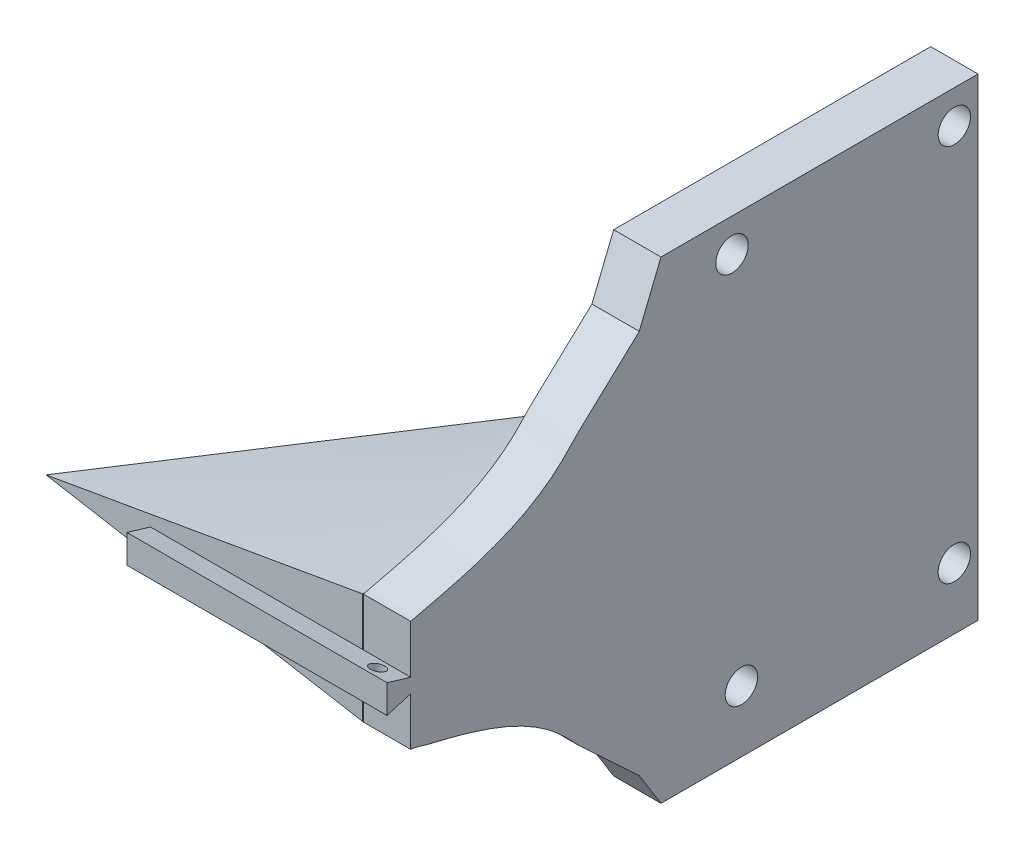
ISO-10303-21;
HEADER;
FILE_DESCRIPTION(('STEP AP214'),'2;1');
FILE_NAME('part.step','',(''),(''),'','','');
FILE_SCHEMA(('AUTOMOTIVE_DESIGN { 1 0 10303 214 1 1 1 1 }'));
ENDSEC;
DATA;
#1=APPLICATION_CONTEXT('core data for automotive mechanical design processes');
#2=APPLICATION_PROTOCOL_DEFINITION('international standard','automotive_design',2000,#1);
#3=PRODUCT_CONTEXT('',#1,'mechanical');
#4=PRODUCT('Part','Part','',(#3));
#5=PRODUCT_RELATED_PRODUCT_CATEGORY('part','',(#4));
#6=PRODUCT_DEFINITION_FORMATION('','',#4);
#7=PRODUCT_DEFINITION_CONTEXT('part definition',#1,'design');
#8=PRODUCT_DEFINITION('design','',#6,#7);
#9=PRODUCT_DEFINITION_SHAPE('','',#8);
#10=(LENGTH_UNIT() NAMED_UNIT(*) SI_UNIT(.MILLI.,.METRE.));
#11=(NAMED_UNIT(*) PLANE_ANGLE_UNIT() SI_UNIT($,.RADIAN.));
#12=(NAMED_UNIT(*) SI_UNIT($,.STERADIAN.) SOLID_ANGLE_UNIT());
#13=UNCERTAINTY_MEASURE_WITH_UNIT(LENGTH_MEASURE(1.E-05),#10,'distance_accuracy_value','');
#14=(GEOMETRIC_REPRESENTATION_CONTEXT(3) GLOBAL_UNCERTAINTY_ASSIGNED_CONTEXT((#13)) GLOBAL_UNIT_ASSIGNED_CONTEXT((#10,
#11,#12)) REPRESENTATION_CONTEXT('',''));
#15=CARTESIAN_POINT('',(0.,0.,0.));
#16=DIRECTION('',(0.,0.,1.));
#17=DIRECTION('',(1.,0.,0.));
#18=AXIS2_PLACEMENT_3D('',#15,#16,#17);
#19=CARTESIAN_POINT('',(-43.8770812291536,1.50000000000052,9.23932452963864E-13));
#20=DIRECTION('',(0.,0.,-1.));
#21=DIRECTION('',(-1.,0.,0.));
#22=AXIS2_PLACEMENT_3D('',#19,#20,#21);
#23=PLANE('',#22);
#24=DIRECTION('',(1.,0.,0.));
#25=VECTOR('',#24,1.);
#26=CARTESIAN_POINT('',(-43.8770812291536,-1.49999999999948,9.2356505892412E-13));
#27=LINE('',#26,#25);
#28=CARTESIAN_POINT('',(0.962918770845575,-1.50000000000001,1.10749108721537E-13));
#29=VERTEX_POINT('',#28);
#30=CARTESIAN_POINT('',(1.12291877084637,-1.50000000000001,1.07848784189131E-13));
#31=VERTEX_POINT('',#30);
#32=EDGE_CURVE('E213',#29,#31,#27,.T.);
#33=ORIENTED_EDGE('',*,*,#32,.F.);
#34=DIRECTION('',(0.,1.,0.));
#35=VECTOR('',#34,1.);
#36=CARTESIAN_POINT('',(0.96291877084558,-7.35277027721134,0.));
#37=LINE('',#36,#35);
#38=CARTESIAN_POINT('',(0.962918770845582,1.49999999999999,1.11116502761281E-13));
#39=VERTEX_POINT('',#38);
#40=EDGE_CURVE('E220',#29,#39,#37,.T.);
#41=ORIENTED_EDGE('',*,*,#40,.T.);
#42=DIRECTION('',(1.,0.,0.));
#43=VECTOR('',#42,1.);
#44=CARTESIAN_POINT('',(-43.8770812291536,1.50000000000052,9.23932452963864E-13));
#45=LINE('',#44,#43);
#46=CARTESIAN_POINT('',(1.12291877084637,1.49999999999999,1.08216178228876E-13));
#47=VERTEX_POINT('',#46);
#48=EDGE_CURVE('E676',#39,#47,#45,.T.);
#49=ORIENTED_EDGE('',*,*,#48,.T.);
#50=DIRECTION('',(0.,-1.,0.));
#51=VECTOR('',#50,1.);
#52=CARTESIAN_POINT('',(1.12291877084638,-11.7212844616731,0.));
#53=LINE('',#52,#51);
#54=EDGE_CURVE('E574',#47,#31,#53,.T.);
#55=ORIENTED_EDGE('',*,*,#54,.T.);
#56=EDGE_LOOP('',(#33,#41,#49,#55));
#57=FACE_BOUND('',#56,.T.);
#58=ADVANCED_FACE('F201',(#57),#23,.T.);
#59=CARTESIAN_POINT('',(1.12291877084638,-11.7212844616731,0.));
#60=DIRECTION('',(0.,0.,1.));
#61=DIRECTION('',(1.,0.,0.));
#62=AXIS2_PLACEMENT_3D('',#59,#60,#61);
#63=PLANE('',#62);
#64=CARTESIAN_POINT('',(1.12291877084638,11.7212844616731,0.));
#65=VERTEX_POINT('',#64);
#66=EDGE_CURVE('E590',#65,#47,#53,.T.);
#67=ORIENTED_EDGE('',*,*,#66,.T.);
#68=CARTESIAN_POINT('',(11.1229187708464,1.5000000000002,0.));
#69=VERTEX_POINT('',#68);
#70=EDGE_CURVE('E210',#47,#69,#45,.T.);
#71=ORIENTED_EDGE('',*,*,#70,.T.);
#72=DIRECTION('',(0.,-1.,0.));
#73=VECTOR('',#72,1.);
#74=CARTESIAN_POINT('',(11.1229187708464,-11.7212844616731,0.));
#75=LINE('',#74,#73);
#76=CARTESIAN_POINT('',(11.1229187708464,11.7212844616731,0.));
#77=VERTEX_POINT('',#76);
#78=EDGE_CURVE('E572',#77,#69,#75,.T.);
#79=ORIENTED_EDGE('',*,*,#78,.F.);
#80=DIRECTION('',(1.,0.,0.));
#81=VECTOR('',#80,1.);
#82=CARTESIAN_POINT('',(1.12291877084638,11.7212844616731,0.));
#83=LINE('',#82,#81);
#84=EDGE_CURVE('E518',#65,#77,#83,.T.);
#85=ORIENTED_EDGE('',*,*,#84,.F.);
#86=EDGE_LOOP('',(#67,#71,#79,#85));
#87=FACE_BOUND('',#86,.T.);
#88=ADVANCED_FACE('F463',(#87),#63,.T.);
#89=CARTESIAN_POINT('',(11.1229187708464,-1.50000000000013,0.));
#90=VERTEX_POINT('',#89);
#91=EDGE_CURVE('E12',#31,#90,#27,.T.);
#92=ORIENTED_EDGE('',*,*,#91,.F.);
#93=CARTESIAN_POINT('',(1.12291877084638,-11.7212844616731,0.));
#94=VERTEX_POINT('',#93);
#95=EDGE_CURVE('E679',#31,#94,#53,.T.);
#96=ORIENTED_EDGE('',*,*,#95,.T.);
#97=DIRECTION('',(1.,0.,0.));
#98=VECTOR('',#97,1.);
#99=CARTESIAN_POINT('',(1.12291877084638,-11.7212844616731,0.));
#100=LINE('',#99,#98);
#101=CARTESIAN_POINT('',(11.1229187708464,-11.7212844616731,0.));
#102=VERTEX_POINT('',#101);
#103=EDGE_CURVE('E552',#94,#102,#100,.T.);
#104=ORIENTED_EDGE('',*,*,#103,.T.);
#105=EDGE_CURVE('E569',#90,#102,#75,.T.);
#106=ORIENTED_EDGE('',*,*,#105,.F.);
#107=EDGE_LOOP('',(#92,#96,#104,#106));
#108=FACE_BOUND('',#107,.T.);
#109=ADVANCED_FACE('F468',(#108),#63,.T.);
#110=CARTESIAN_POINT('',(1.12291877084604,-40.6534142219299,-48.2960542107961));
#111=DIRECTION('',(0.,-0.528663777933964,0.848831320051628));
#112=DIRECTION('',(0.,-0.848831320051628,-0.528663777933964));
#113=AXIS2_PLACEMENT_3D('',#110,#111,#112);
#114=PLANE('',#113);
#115=CARTESIAN_POINT('',(11.122918770846,-40.6534142219299,-48.2960542107962));
#116=CARTESIAN_POINT('',(11.122918770846,-48.0309105660179,-52.8908600300753));
#117=B_SPLINE_CURVE_WITH_KNOTS('',1,(#115,#116),.UNSPECIFIED.,.F.,.F.,(2,2),(0.,1.),.UNSPECIFIED.);
#118=CARTESIAN_POINT('',(11.122918770846,-40.6534142219299,-48.2960542107962));
#119=VERTEX_POINT('',#118);
#120=CARTESIAN_POINT('',(11.122918770846,-48.0309105660179,-52.8908600300753));
#121=VERTEX_POINT('',#120);
#122=EDGE_CURVE('E568',#119,#121,#117,.T.);
#123=ORIENTED_EDGE('',*,*,#122,.F.);
#124=DIRECTION('',(1.,0.,0.));
#125=VECTOR('',#124,1.);
#126=CARTESIAN_POINT('',(1.12291877084604,-40.6534142219299,-48.2960542107961));
#127=LINE('',#126,#125);
#128=CARTESIAN_POINT('',(1.12291877084604,-40.6534142219299,-48.2960542107961));
#129=VERTEX_POINT('',#128);
#130=EDGE_CURVE('E519',#129,#119,#127,.T.);
#131=ORIENTED_EDGE('',*,*,#130,.F.);
#132=CARTESIAN_POINT('',(1.12291877084604,-40.6534142219299,-48.2960542107961));
#133=CARTESIAN_POINT('',(1.12291877084601,-48.0309105660179,-52.8908600300753));
#134=B_SPLINE_CURVE_WITH_KNOTS('',1,(#132,#133),.UNSPECIFIED.,.F.,.F.,(2,2),(0.,1.),.UNSPECIFIED.);
#135=CARTESIAN_POINT('',(1.12291877084601,-48.0309105660179,-52.8908600300753));
#136=VERTEX_POINT('',#135);
#137=EDGE_CURVE('E546',#129,#136,#134,.T.);
#138=ORIENTED_EDGE('',*,*,#137,.T.);
#139=DIRECTION('',(1.,0.,0.));
#140=VECTOR('',#139,1.);
#141=CARTESIAN_POINT('',(1.12291877084601,-48.0309105660179,-52.8908600300753));
#142=LINE('',#141,#140);
#143=EDGE_CURVE('E551',#136,#121,#142,.T.);
#144=ORIENTED_EDGE('',*,*,#143,.T.);
#145=EDGE_LOOP('',(#123,#131,#138,#144));
#146=FACE_BOUND('',#145,.T.);
#147=ADVANCED_FACE('F484',(#146),#114,.T.);
#148=CARTESIAN_POINT('',(1.12291877084638,-11.7212844616731,0.));
#149=CARTESIAN_POINT('',(1.12291877084637,-11.7957609670483,-1.05679071993206));
#150=CARTESIAN_POINT('',(1.12291877084635,-12.5699102613416,-3.1771284252955));
#151=CARTESIAN_POINT('',(1.12291877084633,-13.1768755470558,-6.12985224905279));
#152=CARTESIAN_POINT('',(1.12291877084631,-13.9662185926524,-9.12701697723162));
#153=CARTESIAN_POINT('',(1.12291877084629,-14.7533805583197,-12.0029771518105));
#154=CARTESIAN_POINT('',(1.12291877084627,-15.7871285152694,-15.3317991784619));
#155=CARTESIAN_POINT('',(1.12291877084624,-16.9873063128013,-18.6813386409453));
#156=CARTESIAN_POINT('',(1.12291877084622,-18.4328433633397,-22.0422962994874));
#157=CARTESIAN_POINT('',(1.1229187708462,-19.9461704242026,-24.9711880695502));
#158=CARTESIAN_POINT('',(1.12291877084618,-21.6631883448909,-27.7573050798041));
#159=CARTESIAN_POINT('',(1.12291877084616,-23.7179455810989,-30.5385992974575));
#160=CARTESIAN_POINT('',(1.12291877084614,-26.1629483635974,-33.1168346807232));
#161=CARTESIAN_POINT('',(1.12291877084613,-28.624744086619,-35.3202312972234));
#162=CARTESIAN_POINT('',(1.12291877084611,-30.6908829245273,-37.6358415487435));
#163=CARTESIAN_POINT('',(1.12291877084608,-34.7138484719793,-41.8971248216837));
#164=CARTESIAN_POINT('',(1.12291877084606,-38.0418687131716,-45.5238594041665));
#165=CARTESIAN_POINT('',(1.12291877084604,-40.6534142219299,-48.2960542107961));
#166=B_SPLINE_CURVE_WITH_KNOTS('',3,(#148,#149,#150,#151,#152,#153,#154,#155,#156,#157,#158,
#159,#160,#161,#162,#163,#164,#165),.UNSPECIFIED.,.F.,.F.,(4,1,1,1,1,1,1,1,1,1,1,1,1,1,1,4),(0.,
0.0547764379884916,0.113684498778145,0.155511464198572,0.213946507466747,0.266998103481297,
0.334647937930746,0.396759471953919,0.454940857044665,0.503949026546772,0.564878370917525,
0.632336278952794,0.68620976969534,0.734567942488069,0.791707336132139,0.98752495134111),.UNSPECIFIED.);
#167=DIRECTION('',(1.,0.,0.));
#168=VECTOR('',#167,1.);
#169=SURFACE_OF_LINEAR_EXTRUSION('',#166,#168);
#170=CARTESIAN_POINT('',(11.1229187708464,-11.7212844616731,0.));
#171=CARTESIAN_POINT('',(11.1229187708464,-11.7957609670483,-1.05679071993212));
#172=CARTESIAN_POINT('',(11.1229187708464,-12.5699102613416,-3.17712842529557));
#173=CARTESIAN_POINT('',(11.1229187708463,-13.1768755470558,-6.12985224905286));
#174=CARTESIAN_POINT('',(11.1229187708463,-13.9662185926524,-9.12701697723169));
#175=CARTESIAN_POINT('',(11.1229187708463,-14.7533805583197,-12.0029771518106));
#176=CARTESIAN_POINT('',(11.1229187708463,-15.7871285152694,-15.3317991784619));
#177=CARTESIAN_POINT('',(11.1229187708462,-16.9873063128013,-18.6813386409454));
#178=CARTESIAN_POINT('',(11.1229187708462,-18.4328433633397,-22.0422962994875));
#179=CARTESIAN_POINT('',(11.1229187708462,-19.9461704242026,-24.9711880695503));
#180=CARTESIAN_POINT('',(11.1229187708462,-21.6631883448909,-27.7573050798042));
#181=CARTESIAN_POINT('',(11.1229187708462,-23.7179455810989,-30.5385992974575));
#182=CARTESIAN_POINT('',(11.1229187708461,-26.1629483635974,-33.1168346807232));
#183=CARTESIAN_POINT('',(11.1229187708461,-28.624744086619,-35.3202312972235));
#184=CARTESIAN_POINT('',(11.1229187708461,-30.6908829245273,-37.6358415487435));
#185=CARTESIAN_POINT('',(11.1229187708461,-34.7138484719793,-41.8971248216837));
#186=CARTESIAN_POINT('',(11.1229187708461,-38.0418687131716,-45.5238594041665));
#187=CARTESIAN_POINT('',(11.122918770846,-40.6534142219299,-48.2960542107962));
#188=B_SPLINE_CURVE_WITH_KNOTS('',3,(#170,#171,#172,#173,#174,#175,#176,#177,#178,#179,#180,
#181,#182,#183,#184,#185,#186,#187),.UNSPECIFIED.,.F.,.F.,(4,1,1,1,1,1,1,1,1,1,1,1,1,1,1,4),(0.,
0.0547764379884916,0.113684498778145,0.155511464198572,0.213946507466747,0.266998103481297,
0.334647937930746,0.396759471953919,0.454940857044665,0.503949026546772,0.564878370917525,
0.632336278952794,0.68620976969534,0.734567942488069,0.791707336132139,0.98752495134111),.UNSPECIFIED.);
#189=EDGE_CURVE('E578',#102,#119,#188,.T.);
#190=ORIENTED_EDGE('',*,*,#189,.F.);
#191=ORIENTED_EDGE('',*,*,#103,.F.);
#192=EDGE_CURVE('E593',#94,#129,#166,.T.);
#193=ORIENTED_EDGE('',*,*,#192,.T.);
#194=ORIENTED_EDGE('',*,*,#130,.T.);
#195=EDGE_LOOP('',(#190,#191,#193,#194));
#196=FACE_BOUND('',#195,.T.);
#197=ADVANCED_FACE('F487',(#196),#169,.T.);
#198=CARTESIAN_POINT('',(1.12291877084604,40.6534142219299,-48.2960542107961));
#199=CARTESIAN_POINT('',(1.12291877084606,38.0418687131716,-45.5238594041664));
#200=CARTESIAN_POINT('',(1.12291877084608,34.7138484719793,-41.8971248216837));
#201=CARTESIAN_POINT('',(1.12291877084611,30.6908829245273,-37.6358415487434));
#202=CARTESIAN_POINT('',(1.12291877084613,28.624744086619,-35.3202312972234));
#203=CARTESIAN_POINT('',(1.12291877084614,26.1629483635974,-33.1168346807231));
#204=CARTESIAN_POINT('',(1.12291877084616,23.7179455810989,-30.5385992974574));
#205=CARTESIAN_POINT('',(1.12291877084618,21.6631883448909,-27.7573050798041));
#206=CARTESIAN_POINT('',(1.1229187708462,19.9461704242026,-24.9711880695502));
#207=CARTESIAN_POINT('',(1.12291877084622,18.4328433633397,-22.0422962994873));
#208=CARTESIAN_POINT('',(1.12291877084624,16.9873063128013,-18.6813386409453));
#209=CARTESIAN_POINT('',(1.12291877084627,15.7871285152694,-15.3317991784619));
#210=CARTESIAN_POINT('',(1.12291877084629,14.7533805583198,-12.0029771518105));
#211=CARTESIAN_POINT('',(1.12291877084631,13.9662185926524,-9.12701697723162));
#212=CARTESIAN_POINT('',(1.12291877084633,13.1768755470558,-6.12985224905278));
#213=CARTESIAN_POINT('',(1.12291877084635,12.5699102613416,-3.17712842529548));
#214=CARTESIAN_POINT('',(1.12291877084637,11.7957609670483,-1.05679071993204));
#215=CARTESIAN_POINT('',(1.12291877084638,11.7212844616731,0.));
#216=B_SPLINE_CURVE_WITH_KNOTS('',3,(#198,#199,#200,#201,#202,#203,#204,#205,#206,#207,#208,
#209,#210,#211,#212,#213,#214,#215),.UNSPECIFIED.,.F.,.F.,(4,1,1,1,1,1,1,1,1,1,1,1,1,1,1,4),(0.,
0.195817615208971,0.252957008853041,0.30131518164577,0.355188672388316,0.422646580423585,
0.483575924794339,0.532584094296445,0.590765479387194,0.652877013410364,0.720526847859813,
0.773578443874362,0.832013487142538,0.873840452562965,0.932748513352618,0.98752495134111),.UNSPECIFIED.);
#217=DIRECTION('',(1.,0.,0.));
#218=VECTOR('',#217,1.);
#219=SURFACE_OF_LINEAR_EXTRUSION('',#216,#218);
#220=CARTESIAN_POINT('',(11.122918770846,40.6534142219299,-48.2960542107962));
#221=CARTESIAN_POINT('',(11.1229187708461,38.0418687131716,-45.5238594041665));
#222=CARTESIAN_POINT('',(11.1229187708461,34.7138484719793,-41.8971248216837));
#223=CARTESIAN_POINT('',(11.1229187708461,30.6908829245273,-37.6358415487435));
#224=CARTESIAN_POINT('',(11.1229187708461,28.624744086619,-35.3202312972235));
#225=CARTESIAN_POINT('',(11.1229187708461,26.1629483635974,-33.1168346807232));
#226=CARTESIAN_POINT('',(11.1229187708462,23.7179455810989,-30.5385992974575));
#227=CARTESIAN_POINT('',(11.1229187708462,21.6631883448909,-27.7573050798042));
#228=CARTESIAN_POINT('',(11.1229187708462,19.9461704242026,-24.9711880695502));
#229=CARTESIAN_POINT('',(11.1229187708462,18.4328433633397,-22.0422962994874));
#230=CARTESIAN_POINT('',(11.1229187708462,16.9873063128013,-18.6813386409454));
#231=CARTESIAN_POINT('',(11.1229187708463,15.7871285152694,-15.3317991784619));
#232=CARTESIAN_POINT('',(11.1229187708463,14.7533805583198,-12.0029771518106));
#233=CARTESIAN_POINT('',(11.1229187708463,13.9662185926524,-9.12701697723169));
#234=CARTESIAN_POINT('',(11.1229187708463,13.1768755470558,-6.12985224905285));
#235=CARTESIAN_POINT('',(11.1229187708464,12.5699102613416,-3.17712842529555));
#236=CARTESIAN_POINT('',(11.1229187708464,11.7957609670483,-1.05679071993211));
#237=CARTESIAN_POINT('',(11.1229187708464,11.7212844616731,0.));
#238=B_SPLINE_CURVE_WITH_KNOTS('',3,(#220,#221,#222,#223,#224,#225,#226,#227,#228,#229,#230,
#231,#232,#233,#234,#235,#236,#237),.UNSPECIFIED.,.F.,.F.,(4,1,1,1,1,1,1,1,1,1,1,1,1,1,1,4),(0.,
0.195817615208971,0.252957008853041,0.30131518164577,0.355188672388316,0.422646580423585,
0.483575924794339,0.532584094296445,0.590765479387194,0.652877013410364,0.720526847859813,
0.773578443874362,0.832013487142538,0.873840452562965,0.932748513352618,0.98752495134111),.UNSPECIFIED.);
#239=CARTESIAN_POINT('',(11.122918770846,40.6534142219299,-48.2960542107962));
#240=VERTEX_POINT('',#239);
#241=EDGE_CURVE('E573',#240,#77,#238,.T.);
#242=ORIENTED_EDGE('',*,*,#241,.F.);
#243=DIRECTION('',(1.,0.,0.));
#244=VECTOR('',#243,1.);
#245=CARTESIAN_POINT('',(1.12291877084604,40.6534142219299,-48.2960542107961));
#246=LINE('',#245,#244);
#247=CARTESIAN_POINT('',(1.12291877084604,40.6534142219299,-48.2960542107961));
#248=VERTEX_POINT('',#247);
#249=EDGE_CURVE('E530',#248,#240,#246,.T.);
#250=ORIENTED_EDGE('',*,*,#249,.F.);
#251=EDGE_CURVE('E511',#248,#65,#216,.T.);
#252=ORIENTED_EDGE('',*,*,#251,.T.);
#253=ORIENTED_EDGE('',*,*,#84,.T.);
#254=EDGE_LOOP('',(#242,#250,#252,#253));
#255=FACE_BOUND('',#254,.T.);
#256=ADVANCED_FACE('F505',(#255),#219,.T.);
#257=CARTESIAN_POINT('',(1.12291877084601,51.9690894339821,-52.8908600300753));
#258=DIRECTION('',(0.,0.376223320622477,0.9265290135877));
#259=DIRECTION('',(0.,-0.9265290135877,0.376223320622477));
#260=AXIS2_PLACEMENT_3D('',#257,#258,#259);
#261=PLANE('',#260);
#262=CARTESIAN_POINT('',(11.122918770846,51.9690894339821,-52.8908600300753));
#263=CARTESIAN_POINT('',(11.122918770846,40.6534142219299,-48.2960542107962));
#264=B_SPLINE_CURVE_WITH_KNOTS('',1,(#262,#263),.UNSPECIFIED.,.F.,.F.,(2,2),(0.,1.),.UNSPECIFIED.);
#265=CARTESIAN_POINT('',(11.122918770846,51.9690894339821,-52.8908600300753));
#266=VERTEX_POINT('',#265);
#267=EDGE_CURVE('E735',#266,#240,#264,.T.);
#268=ORIENTED_EDGE('',*,*,#267,.F.);
#269=DIRECTION('',(1.,0.,0.));
#270=VECTOR('',#269,1.);
#271=CARTESIAN_POINT('',(1.12291877084601,51.9690894339821,-52.8908600300753));
#272=LINE('',#271,#270);
#273=CARTESIAN_POINT('',(1.12291877084601,51.9690894339821,-52.8908600300753));
#274=VERTEX_POINT('',#273);
#275=EDGE_CURVE('E537',#274,#266,#272,.T.);
#276=ORIENTED_EDGE('',*,*,#275,.F.);
#277=CARTESIAN_POINT('',(1.12291877084601,51.9690894339821,-52.8908600300753));
#278=CARTESIAN_POINT('',(1.12291877084604,40.6534142219299,-48.2960542107961));
#279=B_SPLINE_CURVE_WITH_KNOTS('',1,(#277,#278),.UNSPECIFIED.,.F.,.F.,(2,2),(0.,1.),.UNSPECIFIED.);
#280=EDGE_CURVE('E522',#274,#248,#279,.T.);
#281=ORIENTED_EDGE('',*,*,#280,.T.);
#282=ORIENTED_EDGE('',*,*,#249,.T.);
#283=EDGE_LOOP('',(#268,#276,#281,#282));
#284=FACE_BOUND('',#283,.T.);
#285=ADVANCED_FACE('F501',(#284),#261,.T.);
#286=CARTESIAN_POINT('',(1.12291877084554,51.9690894339821,-119.890860030075));
#287=DIRECTION('',(0.,1.,0.));
#288=DIRECTION('',(0.,0.,1.));
#289=AXIS2_PLACEMENT_3D('',#286,#287,#288);
#290=PLANE('',#289);
#291=DIRECTION('',(0.,0.,1.));
#292=VECTOR('',#291,1.);
#293=CARTESIAN_POINT('',(11.1229187708455,51.9690894339821,-119.890860030075));
#294=LINE('',#293,#292);
#295=CARTESIAN_POINT('',(11.1229187708455,51.9690894339821,-119.890860030075));
#296=VERTEX_POINT('',#295);
#297=EDGE_CURVE('E739',#296,#266,#294,.T.);
#298=ORIENTED_EDGE('',*,*,#297,.F.);
#299=DIRECTION('',(1.,0.,0.));
#300=VECTOR('',#299,1.);
#301=CARTESIAN_POINT('',(1.12291877084554,51.9690894339821,-119.890860030075));
#302=LINE('',#301,#300);
#303=CARTESIAN_POINT('',(1.12291877084554,51.9690894339821,-119.890860030075));
#304=VERTEX_POINT('',#303);
#305=EDGE_CURVE('E541',#304,#296,#302,.T.);
#306=ORIENTED_EDGE('',*,*,#305,.F.);
#307=DIRECTION('',(0.,0.,1.));
#308=VECTOR('',#307,1.);
#309=CARTESIAN_POINT('',(1.12291877084554,51.9690894339821,-119.890860030075));
#310=LINE('',#309,#308);
#311=EDGE_CURVE('E531',#304,#274,#310,.T.);
#312=ORIENTED_EDGE('',*,*,#311,.T.);
#313=ORIENTED_EDGE('',*,*,#275,.T.);
#314=EDGE_LOOP('',(#298,#306,#312,#313));
#315=FACE_BOUND('',#314,.T.);
#316=ADVANCED_FACE('F497',(#315),#290,.T.);
#317=CARTESIAN_POINT('',(1.12291877084554,51.9690894339821,-119.890860030075));
#318=DIRECTION('',(0.,0.,-1.));
#319=DIRECTION('',(-1.,0.,0.));
#320=AXIS2_PLACEMENT_3D('',#317,#318,#319);
#321=PLANE('',#320);
#322=DIRECTION('',(0.,1.,0.));
#323=VECTOR('',#322,1.);
#324=CARTESIAN_POINT('',(11.1229187708455,51.9690894339821,-119.890860030075));
#325=LINE('',#324,#323);
#326=CARTESIAN_POINT('',(11.1229187708455,-48.0309105660179,-119.890860030075));
#327=VERTEX_POINT('',#326);
#328=EDGE_CURVE('E742',#327,#296,#325,.T.);
#329=ORIENTED_EDGE('',*,*,#328,.F.);
#330=DIRECTION('',(1.,0.,0.));
#331=VECTOR('',#330,1.);
#332=CARTESIAN_POINT('',(1.12291877084554,-48.0309105660179,-119.890860030075));
#333=LINE('',#332,#331);
#334=CARTESIAN_POINT('',(1.12291877084554,-48.0309105660179,-119.890860030075));
#335=VERTEX_POINT('',#334);
#336=EDGE_CURVE('E545',#335,#327,#333,.T.);
#337=ORIENTED_EDGE('',*,*,#336,.F.);
#338=DIRECTION('',(0.,1.,0.));
#339=VECTOR('',#338,1.);
#340=CARTESIAN_POINT('',(1.12291877084554,51.9690894339821,-119.890860030075));
#341=LINE('',#340,#339);
#342=EDGE_CURVE('E538',#335,#304,#341,.T.);
#343=ORIENTED_EDGE('',*,*,#342,.T.);
#344=ORIENTED_EDGE('',*,*,#305,.T.);
#345=EDGE_LOOP('',(#329,#337,#343,#344));
#346=FACE_BOUND('',#345,.T.);
#347=ADVANCED_FACE('F493',(#346),#321,.T.);
#348=CARTESIAN_POINT('',(1.12291877084554,-48.0309105660179,-119.890860030075));
#349=DIRECTION('',(0.,-1.,0.));
#350=DIRECTION('',(1.,0.,0.));
#351=AXIS2_PLACEMENT_3D('',#348,#349,#350);
#352=PLANE('',#351);
#353=DIRECTION('',(0.,0.,-1.));
#354=VECTOR('',#353,1.);
#355=CARTESIAN_POINT('',(11.1229187708455,-48.0309105660179,-119.890860030075));
#356=LINE('',#355,#354);
#357=EDGE_CURVE('E657',#121,#327,#356,.T.);
#358=ORIENTED_EDGE('',*,*,#357,.F.);
#359=ORIENTED_EDGE('',*,*,#143,.F.);
#360=DIRECTION('',(0.,0.,-1.));
#361=VECTOR('',#360,1.);
#362=CARTESIAN_POINT('',(1.12291877084554,-48.0309105660179,-119.890860030075));
#363=LINE('',#362,#361);
#364=EDGE_CURVE('E542',#136,#335,#363,.T.);
#365=ORIENTED_EDGE('',*,*,#364,.T.);
#366=ORIENTED_EDGE('',*,*,#336,.T.);
#367=EDGE_LOOP('',(#358,#359,#365,#366));
#368=FACE_BOUND('',#367,.T.);
#369=ADVANCED_FACE('F489',(#368),#352,.T.);
#370=CARTESIAN_POINT('',(1.12291877084619,21.2444584192039,-27.0434474597605));
#371=DIRECTION('',(1.,0.,0.));
#372=DIRECTION('',(0.,0.,-1.));
#373=AXIS2_PLACEMENT_3D('',#370,#371,#372);
#374=PLANE('',#373);
#375=CARTESIAN_POINT('',(1.12291877084393,-35.0309105360178,-114.890860030075));
#376=DIRECTION('',(1.,0.,0.));
#377=DIRECTION('',(0.,0.,-1.));
#378=AXIS2_PLACEMENT_3D('',#375,#376,#377);
#379=CIRCLE('',#378,3.429);
#380=CARTESIAN_POINT('',(1.12291877084387,-35.0309105360178,-118.319860030075));
#381=VERTEX_POINT('',#380);
#382=EDGE_CURVE('E553',#381,#381,#379,.T.);
#383=ORIENTED_EDGE('',*,*,#382,.T.);
#384=EDGE_LOOP('',(#383));
#385=FACE_BOUND('',#384,.T.);
#386=CARTESIAN_POINT('',(1.12291877084574,44.9690894639822,-67.8908600300753));
#387=DIRECTION('',(1.,0.,0.));
#388=DIRECTION('',(0.,0.,-1.));
#389=AXIS2_PLACEMENT_3D('',#386,#387,#388);
#390=CIRCLE('',#389,3.429);
#391=CARTESIAN_POINT('',(1.12291877084567,44.9690894639822,-71.3198600300753));
#392=VERTEX_POINT('',#391);
#393=EDGE_CURVE('E559',#392,#392,#390,.T.);
#394=ORIENTED_EDGE('',*,*,#393,.T.);
#395=EDGE_LOOP('',(#394));
#396=FACE_BOUND('',#395,.T.);
#397=CARTESIAN_POINT('',(1.12291877084475,-35.0309105360178,-69.8908600300753));
#398=DIRECTION('',(1.,0.,0.));
#399=DIRECTION('',(0.,0.,-1.));
#400=AXIS2_PLACEMENT_3D('',#397,#398,#399);
#401=CIRCLE('',#400,3.429);
#402=CARTESIAN_POINT('',(1.12291877084469,-35.0309105360178,-73.3198600300753));
#403=VERTEX_POINT('',#402);
#404=EDGE_CURVE('E562',#403,#403,#401,.T.);
#405=ORIENTED_EDGE('',*,*,#404,.T.);
#406=EDGE_LOOP('',(#405));
#407=FACE_BOUND('',#406,.T.);
#408=CARTESIAN_POINT('',(1.12291877084487,44.9690894639822,-114.890860030075));
#409=DIRECTION('',(1.,0.,0.));
#410=DIRECTION('',(0.,0.,-1.));
#411=AXIS2_PLACEMENT_3D('',#408,#409,#410);
#412=CIRCLE('',#411,3.415);
#413=CARTESIAN_POINT('',(1.12291877084481,44.9690894639822,-118.305860030075));
#414=VERTEX_POINT('',#413);
#415=EDGE_CURVE('E565',#414,#414,#412,.T.);
#416=ORIENTED_EDGE('',*,*,#415,.T.);
#417=EDGE_LOOP('',(#416));
#418=FACE_BOUND('',#417,.T.);
#419=ORIENTED_EDGE('',*,*,#137,.F.);
#420=ORIENTED_EDGE('',*,*,#192,.F.);
#421=ORIENTED_EDGE('',*,*,#95,.F.);
#422=ORIENTED_EDGE('',*,*,#54,.F.);
#423=ORIENTED_EDGE('',*,*,#66,.F.);
#424=ORIENTED_EDGE('',*,*,#251,.F.);
#425=ORIENTED_EDGE('',*,*,#280,.F.);
#426=ORIENTED_EDGE('',*,*,#311,.F.);
#427=ORIENTED_EDGE('',*,*,#342,.F.);
#428=ORIENTED_EDGE('',*,*,#364,.F.);
#429=EDGE_LOOP('',(#419,#420,#421,#422,#423,#424,#425,#426,#427,#428));
#430=FACE_BOUND('',#429,.T.);
#431=ADVANCED_FACE('F492',(#385,#396,#407,#418,#430),#374,.F.);
#432=CARTESIAN_POINT('',(11.1229187708462,21.2444584192039,-27.0434474597606));
#433=DIRECTION('',(1.,0.,0.));
#434=DIRECTION('',(0.,0.,-1.));
#435=AXIS2_PLACEMENT_3D('',#432,#433,#434);
#436=PLANE('',#435);
#437=CARTESIAN_POINT('',(11.1229187708439,-35.0309105360179,-114.890860030075));
#438=DIRECTION('',(1.,0.,0.));
#439=DIRECTION('',(0.,0.,-1.));
#440=AXIS2_PLACEMENT_3D('',#437,#438,#439);
#441=CIRCLE('',#440,3.429);
#442=CARTESIAN_POINT('',(11.1229187708439,-35.0309105360179,-118.319860030075));
#443=VERTEX_POINT('',#442);
#444=EDGE_CURVE('E639',#443,#443,#441,.T.);
#445=ORIENTED_EDGE('',*,*,#444,.F.);
#446=EDGE_LOOP('',(#445));
#447=FACE_BOUND('',#446,.T.);
#448=CARTESIAN_POINT('',(11.1229187708457,44.9690894639821,-67.8908600300755));
#449=DIRECTION('',(1.,0.,0.));
#450=DIRECTION('',(0.,0.,-1.));
#451=AXIS2_PLACEMENT_3D('',#448,#449,#450);
#452=CIRCLE('',#451,3.429);
#453=CARTESIAN_POINT('',(11.1229187708457,44.9690894639821,-71.3198600300755));
#454=VERTEX_POINT('',#453);
#455=EDGE_CURVE('E665',#454,#454,#452,.T.);
#456=ORIENTED_EDGE('',*,*,#455,.F.);
#457=EDGE_LOOP('',(#456));
#458=FACE_BOUND('',#457,.T.);
#459=CARTESIAN_POINT('',(11.1229187708447,-35.0309105360179,-69.8908600300755));
#460=DIRECTION('',(1.,0.,0.));
#461=DIRECTION('',(0.,0.,-1.));
#462=AXIS2_PLACEMENT_3D('',#459,#460,#461);
#463=CIRCLE('',#462,3.429);
#464=CARTESIAN_POINT('',(11.1229187708447,-35.0309105360179,-73.3198600300755));
#465=VERTEX_POINT('',#464);
#466=EDGE_CURVE('E662',#465,#465,#463,.T.);
#467=ORIENTED_EDGE('',*,*,#466,.F.);
#468=EDGE_LOOP('',(#467));
#469=FACE_BOUND('',#468,.T.);
#470=CARTESIAN_POINT('',(11.1229187708449,44.9690894639821,-114.890860030075));
#471=DIRECTION('',(1.,0.,0.));
#472=DIRECTION('',(0.,0.,-1.));
#473=AXIS2_PLACEMENT_3D('',#470,#471,#472);
#474=CIRCLE('',#473,3.415);
#475=CARTESIAN_POINT('',(11.1229187708448,44.9690894639821,-118.305860030075));
#476=VERTEX_POINT('',#475);
#477=EDGE_CURVE('E660',#476,#476,#474,.T.);
#478=ORIENTED_EDGE('',*,*,#477,.F.);
#479=EDGE_LOOP('',(#478));
#480=FACE_BOUND('',#479,.T.);
#481=ORIENTED_EDGE('',*,*,#122,.T.);
#482=ORIENTED_EDGE('',*,*,#357,.T.);
#483=ORIENTED_EDGE('',*,*,#328,.T.);
#484=ORIENTED_EDGE('',*,*,#297,.T.);
#485=ORIENTED_EDGE('',*,*,#267,.T.);
#486=ORIENTED_EDGE('',*,*,#241,.T.);
#487=ORIENTED_EDGE('',*,*,#78,.T.);
#488=DIRECTION('',(0.,0.287347885566352,0.957826285221149));
#489=VECTOR('',#488,1.);
#490=CARTESIAN_POINT('',(11.1229187708466,2.99999999999987,4.9999999999998));
#491=LINE('',#490,#489);
#492=CARTESIAN_POINT('',(11.1229187708466,2.99999999999987,4.9999999999998));
#493=VERTEX_POINT('',#492);
#494=EDGE_CURVE('E333',#69,#493,#491,.T.);
#495=ORIENTED_EDGE('',*,*,#494,.T.);
#496=DIRECTION('',(0.,-1.,0.));
#497=VECTOR('',#496,1.);
#498=CARTESIAN_POINT('',(11.1229187708465,-3.00000000000013,4.9999999999998));
#499=LINE('',#498,#497);
#500=CARTESIAN_POINT('',(11.1229187708465,-3.00000000000013,4.9999999999998));
#501=VERTEX_POINT('',#500);
#502=EDGE_CURVE('E683',#493,#501,#499,.T.);
#503=ORIENTED_EDGE('',*,*,#502,.T.);
#504=DIRECTION('',(0.,0.287347885566352,-0.957826285221149));
#505=VECTOR('',#504,1.);
#506=CARTESIAN_POINT('',(11.1229187708465,-3.00000000000013,4.9999999999998));
#507=LINE('',#506,#505);
#508=EDGE_CURVE('E680',#501,#90,#507,.T.);
#509=ORIENTED_EDGE('',*,*,#508,.T.);
#510=ORIENTED_EDGE('',*,*,#105,.T.);
#511=ORIENTED_EDGE('',*,*,#189,.T.);
#512=EDGE_LOOP('',(#481,#482,#483,#484,#485,#486,#487,#495,#503,#509,#510,#511));
#513=FACE_BOUND('',#512,.T.);
#514=ADVANCED_FACE('F618',(#447,#458,#469,#480,#513),#436,.T.);
#515=CARTESIAN_POINT('',(-66.3511244602257,44.969089463983,-114.890860030074));
#516=DIRECTION('',(1.,0.,0.));
#517=DIRECTION('',(0.,0.,-1.));
#518=AXIS2_PLACEMENT_3D('',#515,#516,#517);
#519=CYLINDRICAL_SURFACE('',#518,3.415);
#520=ORIENTED_EDGE('',*,*,#477,.T.);
#521=EDGE_LOOP('',(#520));
#522=FACE_BOUND('',#521,.T.);
#523=ORIENTED_EDGE('',*,*,#415,.F.);
#524=EDGE_LOOP('',(#523));
#525=FACE_BOUND('',#524,.T.);
#526=ADVANCED_FACE('F621',(#522,#525),#519,.F.);
#527=CARTESIAN_POINT('',(-66.3511244602258,-35.030910536017,-69.8908600300741));
#528=DIRECTION('',(1.,0.,0.));
#529=DIRECTION('',(0.,0.,-1.));
#530=AXIS2_PLACEMENT_3D('',#527,#528,#529);
#531=CYLINDRICAL_SURFACE('',#530,3.429);
#532=ORIENTED_EDGE('',*,*,#466,.T.);
#533=EDGE_LOOP('',(#532));
#534=FACE_BOUND('',#533,.T.);
#535=ORIENTED_EDGE('',*,*,#404,.F.);
#536=EDGE_LOOP('',(#535));
#537=FACE_BOUND('',#536,.T.);
#538=ADVANCED_FACE('F203',(#534,#537),#531,.F.);
#539=CARTESIAN_POINT('',(-66.3511244602249,44.969089463983,-67.8908600300741));
#540=DIRECTION('',(1.,0.,0.));
#541=DIRECTION('',(0.,0.,-1.));
#542=AXIS2_PLACEMENT_3D('',#539,#540,#541);
#543=CYLINDRICAL_SURFACE('',#542,3.429);
#544=ORIENTED_EDGE('',*,*,#455,.T.);
#545=EDGE_LOOP('',(#544));
#546=FACE_BOUND('',#545,.T.);
#547=ORIENTED_EDGE('',*,*,#393,.F.);
#548=EDGE_LOOP('',(#547));
#549=FACE_BOUND('',#548,.T.);
#550=ADVANCED_FACE('F629',(#546,#549),#543,.F.);
#551=CARTESIAN_POINT('',(-66.3511244602267,-35.030910536017,-114.890860030074));
#552=DIRECTION('',(1.,0.,0.));
#553=DIRECTION('',(0.,0.,-1.));
#554=AXIS2_PLACEMENT_3D('',#551,#552,#553);
#555=CYLINDRICAL_SURFACE('',#554,3.429);
#556=ORIENTED_EDGE('',*,*,#444,.T.);
#557=EDGE_LOOP('',(#556));
#558=FACE_BOUND('',#557,.T.);
#559=ORIENTED_EDGE('',*,*,#382,.F.);
#560=EDGE_LOOP('',(#559));
#561=FACE_BOUND('',#560,.T.);
#562=ADVANCED_FACE('F482',(#558,#561),#555,.F.);
#563=CARTESIAN_POINT('',(-43.8770812291534,3.00000000000052,5.0000000000008));
#564=DIRECTION('',(0.,0.957826285221149,-0.287347885566352));
#565=DIRECTION('',(0.,0.287347885566352,0.957826285221149));
#566=AXIS2_PLACEMENT_3D('',#563,#564,#565);
#567=PLANE('',#566);
#568=CARTESIAN_POINT('',(6.62291877084637,2.2499999999999,2.49999999999986));
#569=DIRECTION('',(0.,0.957826285221149,-0.287347885566352));
#570=DIRECTION('',(0.,0.287347885566352,0.957826285221149));
#571=AXIS2_PLACEMENT_3D('',#568,#569,#570);
#572=ELLIPSE('',#571,1.56604597633659,1.5);
#573=CARTESIAN_POINT('',(6.62291877084634,2.69999999999991,3.99999999999986));
#574=VERTEX_POINT('',#573);
#575=EDGE_CURVE('E344',#574,#574,#572,.T.);
#576=ORIENTED_EDGE('',*,*,#575,.F.);
#577=EDGE_LOOP('',(#576));
#578=FACE_BOUND('',#577,.T.);
#579=ORIENTED_EDGE('',*,*,#494,.F.);
#580=ORIENTED_EDGE('',*,*,#70,.F.);
#581=ORIENTED_EDGE('',*,*,#48,.F.);
#582=CARTESIAN_POINT('',(-43.8770812291536,1.50000000000048,7.92613095205611E-13));
#583=VERTEX_POINT('',#582);
#584=EDGE_CURVE('E677',#583,#39,#45,.T.);
#585=ORIENTED_EDGE('',*,*,#584,.F.);
#586=DIRECTION('',(0.,0.287347885566352,0.957826285221149));
#587=VECTOR('',#586,1.);
#588=CARTESIAN_POINT('',(-43.8770812291534,3.00000000000052,5.0000000000008));
#589=LINE('',#588,#587);
#590=CARTESIAN_POINT('',(-43.8770812291534,3.00000000000052,5.0000000000008));
#591=VERTEX_POINT('',#590);
#592=EDGE_CURVE('E682',#583,#591,#589,.T.);
#593=ORIENTED_EDGE('',*,*,#592,.T.);
#594=DIRECTION('',(1.,0.,0.));
#595=VECTOR('',#594,1.);
#596=CARTESIAN_POINT('',(-43.8770812291534,3.00000000000052,5.0000000000008));
#597=LINE('',#596,#595);
#598=EDGE_CURVE('E671',#591,#493,#597,.T.);
#599=ORIENTED_EDGE('',*,*,#598,.T.);
#600=EDGE_LOOP('',(#579,#580,#581,#585,#593,#599));
#601=FACE_BOUND('',#600,.T.);
#602=ADVANCED_FACE('F475',(#578,#601),#567,.T.);
#603=CARTESIAN_POINT('',(-43.8770812291535,-2.99999999999948,5.00000000000079));
#604=DIRECTION('',(0.,-0.957826285221149,-0.287347885566352));
#605=DIRECTION('',(0.,0.287347885566352,-0.957826285221149));
#606=AXIS2_PLACEMENT_3D('',#603,#604,#605);
#607=PLANE('',#606);
#608=CARTESIAN_POINT('',(6.62291877084637,-2.25000000000005,2.49999999999986));
#609=DIRECTION('',(0.,-0.957826285221149,-0.287347885566352));
#610=DIRECTION('',(0.,0.287347885566352,-0.957826285221149));
#611=AXIS2_PLACEMENT_3D('',#608,#609,#610);
#612=ELLIPSE('',#611,1.56604597633659,1.5);
#613=CARTESIAN_POINT('',(6.62291877084629,-1.80000000000004,0.999999999999862));
#614=VERTEX_POINT('',#613);
#615=EDGE_CURVE('E205',#614,#614,#612,.T.);
#616=ORIENTED_EDGE('',*,*,#615,.F.);
#617=EDGE_LOOP('',(#616));
#618=FACE_BOUND('',#617,.T.);
#619=ORIENTED_EDGE('',*,*,#508,.F.);
#620=DIRECTION('',(1.,0.,0.));
#621=VECTOR('',#620,1.);
#622=CARTESIAN_POINT('',(-43.8770812291535,-2.99999999999948,5.00000000000079));
#623=LINE('',#622,#621);
#624=CARTESIAN_POINT('',(-43.8770812291535,-2.99999999999948,5.00000000000079));
#625=VERTEX_POINT('',#624);
#626=EDGE_CURVE('E673',#625,#501,#623,.T.);
#627=ORIENTED_EDGE('',*,*,#626,.F.);
#628=DIRECTION('',(0.,0.287347885566352,-0.957826285221149));
#629=VECTOR('',#628,1.);
#630=CARTESIAN_POINT('',(-43.8770812291535,-2.99999999999948,5.00000000000079));
#631=LINE('',#630,#629);
#632=CARTESIAN_POINT('',(-43.8770812291536,-1.49999999999948,9.2356505892412E-13));
#633=VERTEX_POINT('',#632);
#634=EDGE_CURVE('E690',#625,#633,#631,.T.);
#635=ORIENTED_EDGE('',*,*,#634,.T.);
#636=EDGE_CURVE('E212',#633,#29,#27,.T.);
#637=ORIENTED_EDGE('',*,*,#636,.T.);
#638=ORIENTED_EDGE('',*,*,#32,.T.);
#639=ORIENTED_EDGE('',*,*,#91,.T.);
#640=EDGE_LOOP('',(#619,#627,#635,#637,#638,#639));
#641=FACE_BOUND('',#640,.T.);
#642=ADVANCED_FACE('F472',(#618,#641),#607,.T.);
#643=CARTESIAN_POINT('',(-43.8770812291535,-2.99999999999948,5.00000000000079));
#644=DIRECTION('',(0.,0.,1.));
#645=DIRECTION('',(1.,0.,0.));
#646=AXIS2_PLACEMENT_3D('',#643,#644,#645);
#647=PLANE('',#646);
#648=ORIENTED_EDGE('',*,*,#502,.F.);
#649=ORIENTED_EDGE('',*,*,#598,.F.);
#650=DIRECTION('',(0.,-1.,0.));
#651=VECTOR('',#650,1.);
#652=CARTESIAN_POINT('',(-43.8770812291535,-2.99999999999948,5.00000000000079));
#653=LINE('',#652,#651);
#654=EDGE_CURVE('E692',#591,#625,#653,.T.);
#655=ORIENTED_EDGE('',*,*,#654,.T.);
#656=ORIENTED_EDGE('',*,*,#626,.T.);
#657=EDGE_LOOP('',(#648,#649,#655,#656));
#658=FACE_BOUND('',#657,.T.);
#659=ADVANCED_FACE('F460',(#658),#647,.T.);
#660=CARTESIAN_POINT('',(-43.8770812291536,5.27809363563465E-13,7.9245756188982E-13));
#661=DIRECTION('',(-1.,0.,0.));
#662=DIRECTION('',(0.,0.,1.));
#663=AXIS2_PLACEMENT_3D('',#660,#661,#662);
#664=PLANE('',#663);
#665=ORIENTED_EDGE('',*,*,#592,.F.);
#666=DIRECTION('',(0.,1.,0.));
#667=VECTOR('',#666,1.);
#668=CARTESIAN_POINT('',(-43.8770812291536,1.50000000000052,9.23932452963864E-13));
#669=LINE('',#668,#667);
#670=EDGE_CURVE('E674',#633,#583,#669,.T.);
#671=ORIENTED_EDGE('',*,*,#670,.F.);
#672=ORIENTED_EDGE('',*,*,#634,.F.);
#673=ORIENTED_EDGE('',*,*,#654,.F.);
#674=EDGE_LOOP('',(#665,#671,#672,#673));
#675=FACE_BOUND('',#674,.T.);
#676=ADVANCED_FACE('F455',(#675),#664,.T.);
#677=CARTESIAN_POINT('',(0.,0.,-83.312));
#678=DIRECTION('',(0.,0.,-1.));
#679=DIRECTION('',(-1.,0.,0.));
#680=AXIS2_PLACEMENT_3D('',#677,#678,#679);
#681=PLANE('',#680);
#682=DIRECTION('',(0.,1.,0.));
#683=VECTOR('',#682,1.);
#684=CARTESIAN_POINT('',(0.962918770845577,5.55341733474594,-83.312));
#685=LINE('',#684,#683);
#686=CARTESIAN_POINT('',(0.962918770845577,-5.55341733474594,-83.312));
#687=VERTEX_POINT('',#686);
#688=CARTESIAN_POINT('',(0.962918770845577,5.55341733474594,-83.312));
#689=VERTEX_POINT('',#688);
#690=EDGE_CURVE('E343',#687,#689,#685,.T.);
#691=ORIENTED_EDGE('',*,*,#690,.F.);
#692=DIRECTION('',(0.916232362736076,-0.400647298100296,0.));
#693=VECTOR('',#692,1.);
#694=CARTESIAN_POINT('',(0.962918770845577,-5.55341733474594,-83.312));
#695=LINE('',#694,#693);
#696=CARTESIAN_POINT('',(-11.7370812291544,0.,-83.312));
#697=VERTEX_POINT('',#696);
#698=EDGE_CURVE('E361',#697,#687,#695,.T.);
#699=ORIENTED_EDGE('',*,*,#698,.F.);
#700=DIRECTION('',(-0.916232362736076,-0.400647298100296,0.));
#701=VECTOR('',#700,1.);
#702=CARTESIAN_POINT('',(0.962918770845577,5.55341733474594,-83.312));
#703=LINE('',#702,#701);
#704=EDGE_CURVE('E347',#689,#697,#703,.T.);
#705=ORIENTED_EDGE('',*,*,#704,.F.);
#706=EDGE_LOOP('',(#691,#699,#705));
#707=FACE_BOUND('',#706,.T.);
#708=ADVANCED_FACE('F403',(#707),#681,.T.);
#709=CARTESIAN_POINT('',(0.962918770845577,5.55341733474594,-83.312));
#710=CARTESIAN_POINT('',(0.962918770845034,11.7212844616731,0.60399999999998));
#711=CARTESIAN_POINT('',(-1.15374789582109,4.62784777895495,-83.312));
#712=CARTESIAN_POINT('',(-10.2560717676661,9.76773705139423,0.60399999999998));
#713=CARTESIAN_POINT('',(-3.27041456248776,3.70227822316396,-83.312));
#714=CARTESIAN_POINT('',(-21.4750623061772,7.8141896411154,0.60399999999998));
#715=CARTESIAN_POINT('',(-7.50374789582109,1.85113911158198,-83.312));
#716=CARTESIAN_POINT('',(-43.9130433831996,3.90709482055772,0.60399999999998));
#717=CARTESIAN_POINT('',(-9.62041456248776,0.925569555790991,-83.312));
#718=CARTESIAN_POINT('',(-55.1320339217109,1.95354741027886,0.60399999999998));
#719=CARTESIAN_POINT('',(-11.7370812291544,0.,-83.312));
#720=CARTESIAN_POINT('',(-66.3510244602223,0.,0.60399999999998));
#721=B_SPLINE_SURFACE_WITH_KNOTS('',3,1,((#709,#710),(#711,#712),(#713,#714),(#715,#716),(#717,
#718),(#719,#720)),.UNSPECIFIED.,.F.,.F.,.F.,(4,2,4),(2,2),(0.,0.5,1.),(0.,1.),.UNSPECIFIED.);
#722=CARTESIAN_POINT('',(0.962918770844985,11.6768901656548,0.));
#723=CARTESIAN_POINT('',(-4.6462354115725,10.6981596589667,0.));
#724=CARTESIAN_POINT('',(-10.25538959399,9.7194291522786,0.));
#725=CARTESIAN_POINT('',(-21.473697958825,7.76196813890237,1.47336754413381E-13));
#726=CARTESIAN_POINT('',(-27.0828521412425,6.78323763221425,1.88114505307645E-13));
#727=CARTESIAN_POINT('',(-43.7806479185732,3.86967141701743,3.09453963390525E-13));
#728=CARTESIAN_POINT('',(-54.8692895134865,1.93483570850872,3.89965717005691E-13));
#729=CARTESIAN_POINT('',(-65.9579311083997,0.,4.61761705261576E-13));
#730=B_SPLINE_CURVE_WITH_KNOTS('',3,(#722,#723,#724,#725,#726,#727,#728,#729),.UNSPECIFIED.,.F.,
.F.,(4,2,2,4),(0.,17.0817070698945,34.1634141397889,67.9319506013273),.UNSPECIFIED.);
#731=CARTESIAN_POINT('',(0.962918770846375,11.6768901656549,0.));
#732=VERTEX_POINT('',#731);
#733=CARTESIAN_POINT('',(-65.9579311083997,0.,4.57966997657877E-13));
#734=VERTEX_POINT('',#733);
#735=EDGE_CURVE('E320',#732,#734,#730,.T.);
#736=DIRECTION('',(0.,0.0733027542522309,0.997309734344871));
#737=VECTOR('',#736,1.);
#738=CARTESIAN_POINT('',(0.962918770845577,5.55341733474594,-83.312));
#739=LINE('',#738,#737);
#740=EDGE_CURVE('E352',#689,#732,#739,.T.);
#741=DIRECTION('',(-0.545469520246643,0.,0.838130659552493));
#742=VECTOR('',#741,1.);
#743=CARTESIAN_POINT('',(-39.0440528446884,0.,-41.354));
#744=LINE('',#743,#742);
#745=EDGE_CURVE('E339',#697,#734,#744,.T.);
#746=ORIENTED_EDGE('',*,*,#735,.F.);
#747=ORIENTED_EDGE('',*,*,#740,.F.);
#748=ORIENTED_EDGE('',*,*,#704,.T.);
#749=ORIENTED_EDGE('',*,*,#745,.T.);
#750=EDGE_LOOP('',(#746,#747,#748,#749));
#751=FACE_BOUND('',#750,.T.);
#752=ADVANCED_FACE('F346',(#751),#721,.T.);
#753=CARTESIAN_POINT('',(-11.7370812291544,0.,-83.312));
#754=CARTESIAN_POINT('',(-66.3510244602223,0.,0.60399999999998));
#755=CARTESIAN_POINT('',(-9.62041456248776,-0.925569555790988,-83.312));
#756=CARTESIAN_POINT('',(-55.1320339217111,-1.95354741027882,0.60399999999998));
#757=CARTESIAN_POINT('',(-7.50374789582109,-1.85113911158198,-83.312));
#758=CARTESIAN_POINT('',(-43.9130433831999,-3.90709482055766,0.60399999999998));
#759=CARTESIAN_POINT('',(-3.27041456248776,-3.70227822316396,-83.312));
#760=CARTESIAN_POINT('',(-21.4750623061773,-7.81418964111536,0.60399999999998));
#761=CARTESIAN_POINT('',(-1.15374789582109,-4.62784777895495,-83.312));
#762=CARTESIAN_POINT('',(-10.2560717676659,-9.76773705139423,0.60399999999998));
#763=CARTESIAN_POINT('',(0.962918770845577,-5.55341733474594,-83.312));
#764=CARTESIAN_POINT('',(0.962918770845575,-11.7212844616731,0.60399999999998));
#765=B_SPLINE_SURFACE_WITH_KNOTS('',3,1,((#753,#754),(#755,#756),(#757,#758),(#759,#760),(#761,
#762),(#763,#764)),.UNSPECIFIED.,.F.,.F.,.F.,(4,2,4),(2,2),(0.,0.5,1.),(0.,1.),.UNSPECIFIED.);
#766=CARTESIAN_POINT('',(-65.9579311083997,0.,4.57966997657877E-13));
#767=CARTESIAN_POINT('',(-60.3487769259822,-0.978730506688119,4.20262323015616E-13));
#768=CARTESIAN_POINT('',(-54.7396227435646,-1.95746101337624,3.80775548438923E-13));
#769=CARTESIAN_POINT('',(-43.5213143787295,-3.91492202675249,3.00537096750968E-13));
#770=CARTESIAN_POINT('',(-37.912160196312,-4.89365253344062,2.59785419639708E-13));
#771=CARTESIAN_POINT('',(-21.2143644189811,-7.80721874863746,1.40012080633639E-13));
#772=CARTESIAN_POINT('',(-10.1257228240677,-9.74205445714618,0.));
#773=CARTESIAN_POINT('',(0.962918770845575,-11.6768901656549,0.));
#774=B_SPLINE_CURVE_WITH_KNOTS('',3,(#766,#767,#768,#769,#770,#771,#772,#773),.UNSPECIFIED.,.F.,
.F.,(4,2,2,4),(0.,17.0817070698947,34.1634141397893,67.9319506013279),.UNSPECIFIED.);
#775=CARTESIAN_POINT('',(0.962918770845575,-11.6768901656549,0.));
#776=VERTEX_POINT('',#775);
#777=EDGE_CURVE('E325',#734,#776,#774,.T.);
#778=DIRECTION('',(0.,-0.0733027542522308,0.997309734344871));
#779=VECTOR('',#778,1.);
#780=CARTESIAN_POINT('',(0.962918770845577,-5.55341733474594,-83.312));
#781=LINE('',#780,#779);
#782=EDGE_CURVE('E342',#687,#776,#781,.T.);
#783=ORIENTED_EDGE('',*,*,#777,.F.);
#784=ORIENTED_EDGE('',*,*,#745,.F.);
#785=ORIENTED_EDGE('',*,*,#698,.T.);
#786=ORIENTED_EDGE('',*,*,#782,.T.);
#787=EDGE_LOOP('',(#783,#784,#785,#786));
#788=FACE_BOUND('',#787,.T.);
#789=ADVANCED_FACE('F338',(#788),#765,.T.);
#790=CARTESIAN_POINT('',(0.962918770845581,0.,0.));
#791=DIRECTION('',(-1.,0.,0.));
#792=DIRECTION('',(0.,0.,1.));
#793=AXIS2_PLACEMENT_3D('',#790,#791,#792);
#794=PLANE('',#793);
#795=EDGE_CURVE('E334',#776,#29,#37,.T.);
#796=ORIENTED_EDGE('',*,*,#795,.F.);
#797=ORIENTED_EDGE('',*,*,#782,.F.);
#798=ORIENTED_EDGE('',*,*,#690,.T.);
#799=ORIENTED_EDGE('',*,*,#740,.T.);
#800=EDGE_CURVE('E328',#39,#732,#37,.T.);
#801=ORIENTED_EDGE('',*,*,#800,.F.);
#802=ORIENTED_EDGE('',*,*,#40,.F.);
#803=EDGE_LOOP('',(#796,#797,#798,#799,#801,#802));
#804=FACE_BOUND('',#803,.T.);
#805=ADVANCED_FACE('F377',(#804),#794,.F.);
#806=CARTESIAN_POINT('',(0.,0.,0.));
#807=DIRECTION('',(0.,0.,-1.));
#808=DIRECTION('',(-1.,0.,0.));
#809=AXIS2_PLACEMENT_3D('',#806,#807,#808);
#810=PLANE('',#809);
#811=ORIENTED_EDGE('',*,*,#584,.T.);
#812=ORIENTED_EDGE('',*,*,#800,.T.);
#813=ORIENTED_EDGE('',*,*,#735,.T.);
#814=ORIENTED_EDGE('',*,*,#777,.T.);
#815=ORIENTED_EDGE('',*,*,#795,.T.);
#816=ORIENTED_EDGE('',*,*,#636,.F.);
#817=ORIENTED_EDGE('',*,*,#670,.T.);
#818=EDGE_LOOP('',(#811,#812,#813,#814,#815,#816,#817));
#819=FACE_BOUND('',#818,.T.);
#820=ADVANCED_FACE('F323',(#819),#810,.F.);
#821=CARTESIAN_POINT('',(6.62291877084637,-5.,2.49999999999986));
#822=DIRECTION('',(0.,1.,0.));
#823=DIRECTION('',(0.,0.,1.));
#824=AXIS2_PLACEMENT_3D('',#821,#822,#823);
#825=CYLINDRICAL_SURFACE('',#824,1.5);
#826=ORIENTED_EDGE('',*,*,#575,.T.);
#827=EDGE_LOOP('',(#826));
#828=FACE_BOUND('',#827,.T.);
#829=ORIENTED_EDGE('',*,*,#615,.T.);
#830=EDGE_LOOP('',(#829));
#831=FACE_BOUND('',#830,.T.);
#832=ADVANCED_FACE('F402',(#828,#831),#825,.F.);
#833=CLOSED_SHELL('',(#58,#88,#109,#147,#197,#256,#285,#316,#347,#369,#431,#514,#526,#538,#550,
#562,#602,#642,#659,#676,#708,#752,#789,#805,#820,#832));
#834=MANIFOLD_SOLID_BREP('B2',#833);
#835=ADVANCED_BREP_SHAPE_REPRESENTATION('',(#18,#834),#14);
#836=SHAPE_DEFINITION_REPRESENTATION(#9,#835);
ENDSEC;
END-ISO-10303-21;
